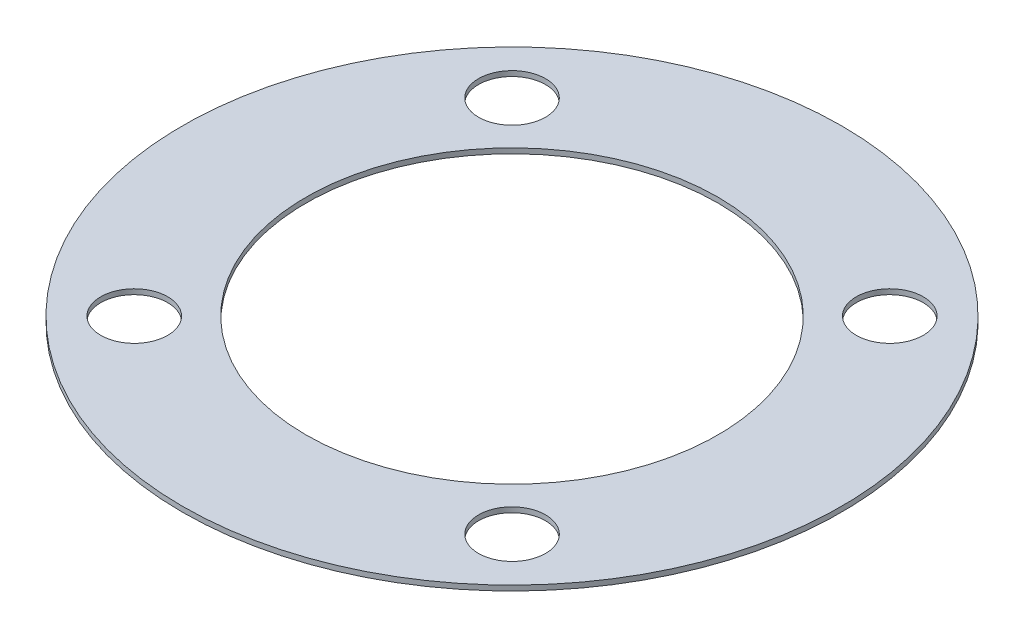
ISO-10303-21;
HEADER;
FILE_DESCRIPTION(('STEP AP214'),'2;1');
FILE_NAME('part.step','',(''),(''),'','','');
FILE_SCHEMA(('AUTOMOTIVE_DESIGN { 1 0 10303 214 1 1 1 1 }'));
ENDSEC;
DATA;
#1=APPLICATION_CONTEXT('core data for automotive mechanical design processes');
#2=APPLICATION_PROTOCOL_DEFINITION('international standard','automotive_design',2000,#1);
#3=PRODUCT_CONTEXT('',#1,'mechanical');
#4=PRODUCT('Part','Part','',(#3));
#5=PRODUCT_RELATED_PRODUCT_CATEGORY('part','',(#4));
#6=PRODUCT_DEFINITION_FORMATION('','',#4);
#7=PRODUCT_DEFINITION_CONTEXT('part definition',#1,'design');
#8=PRODUCT_DEFINITION('design','',#6,#7);
#9=PRODUCT_DEFINITION_SHAPE('','',#8);
#10=(LENGTH_UNIT() NAMED_UNIT(*) SI_UNIT(.MILLI.,.METRE.));
#11=(NAMED_UNIT(*) PLANE_ANGLE_UNIT() SI_UNIT($,.RADIAN.));
#12=(NAMED_UNIT(*) SI_UNIT($,.STERADIAN.) SOLID_ANGLE_UNIT());
#13=UNCERTAINTY_MEASURE_WITH_UNIT(LENGTH_MEASURE(1.E-05),#10,'distance_accuracy_value','');
#14=(GEOMETRIC_REPRESENTATION_CONTEXT(3) GLOBAL_UNCERTAINTY_ASSIGNED_CONTEXT((#13)) GLOBAL_UNIT_ASSIGNED_CONTEXT((#10,
#11,#12)) REPRESENTATION_CONTEXT('',''));
#15=CARTESIAN_POINT('',(0.,0.,0.));
#16=DIRECTION('',(0.,0.,1.));
#17=DIRECTION('',(1.,0.,0.));
#18=AXIS2_PLACEMENT_3D('',#15,#16,#17);
#19=CARTESIAN_POINT('',(0.,0.5,0.));
#20=DIRECTION('',(0.,-1.,0.));
#21=DIRECTION('',(0.,0.,-1.));
#22=AXIS2_PLACEMENT_3D('',#19,#20,#21);
#23=CYLINDRICAL_SURFACE('',#22,32.);
#24=CARTESIAN_POINT('',(0.,0.5,0.));
#25=DIRECTION('',(0.,1.,0.));
#26=DIRECTION('',(0.,0.,1.));
#27=AXIS2_PLACEMENT_3D('',#24,#25,#26);
#28=CIRCLE('',#27,32.);
#29=CARTESIAN_POINT('',(0.,0.5,32.));
#30=VERTEX_POINT('',#29);
#31=EDGE_CURVE('E10',#30,#30,#28,.T.);
#32=ORIENTED_EDGE('',*,*,#31,.F.);
#33=EDGE_LOOP('',(#32));
#34=FACE_BOUND('',#33,.T.);
#35=CARTESIAN_POINT('',(0.,0.,0.));
#36=DIRECTION('',(0.,1.,0.));
#37=DIRECTION('',(0.,0.,1.));
#38=AXIS2_PLACEMENT_3D('',#35,#36,#37);
#39=CIRCLE('',#38,32.);
#40=CARTESIAN_POINT('',(0.,0.,32.));
#41=VERTEX_POINT('',#40);
#42=EDGE_CURVE('E39',#41,#41,#39,.T.);
#43=ORIENTED_EDGE('',*,*,#42,.T.);
#44=EDGE_LOOP('',(#43));
#45=FACE_BOUND('',#44,.T.);
#46=ADVANCED_FACE('F36',(#34,#45),#23,.T.);
#47=CARTESIAN_POINT('',(0.,0.5,0.));
#48=DIRECTION('',(0.,1.,0.));
#49=DIRECTION('',(0.,0.,1.));
#50=AXIS2_PLACEMENT_3D('',#47,#48,#49);
#51=PLANE('',#50);
#52=CARTESIAN_POINT('',(18.3424515582806,0.5,18.3393317385137));
#53=DIRECTION('',(0.,1.,0.));
#54=DIRECTION('',(0.,0.,1.));
#55=AXIS2_PLACEMENT_3D('',#52,#53,#54);
#56=CIRCLE('',#55,3.25);
#57=CARTESIAN_POINT('',(18.3424515582806,0.5,21.5893317385137));
#58=VERTEX_POINT('',#57);
#59=EDGE_CURVE('E66',#58,#58,#56,.T.);
#60=ORIENTED_EDGE('',*,*,#59,.F.);
#61=EDGE_LOOP('',(#60));
#62=FACE_BOUND('',#61,.T.);
#63=CARTESIAN_POINT('',(-18.3393317385137,0.5,18.3424515582806));
#64=DIRECTION('',(0.,1.,0.));
#65=DIRECTION('',(0.,0.,1.));
#66=AXIS2_PLACEMENT_3D('',#63,#64,#65);
#67=CIRCLE('',#66,3.25);
#68=CARTESIAN_POINT('',(-18.3393317385137,0.5,21.5924515582806));
#69=VERTEX_POINT('',#68);
#70=EDGE_CURVE('E74',#69,#69,#67,.T.);
#71=ORIENTED_EDGE('',*,*,#70,.F.);
#72=EDGE_LOOP('',(#71));
#73=FACE_BOUND('',#72,.T.);
#74=CARTESIAN_POINT('',(-18.3393317385137,0.5,-18.3424515582806));
#75=DIRECTION('',(0.,1.,0.));
#76=DIRECTION('',(0.,0.,1.));
#77=AXIS2_PLACEMENT_3D('',#74,#75,#76);
#78=CIRCLE('',#77,3.25);
#79=CARTESIAN_POINT('',(-18.3393317385137,0.5,-15.0924515582806));
#80=VERTEX_POINT('',#79);
#81=EDGE_CURVE('E82',#80,#80,#78,.T.);
#82=ORIENTED_EDGE('',*,*,#81,.F.);
#83=EDGE_LOOP('',(#82));
#84=FACE_BOUND('',#83,.T.);
#85=CARTESIAN_POINT('',(18.3424515582806,0.5,-18.3393317385137));
#86=DIRECTION('',(0.,1.,0.));
#87=DIRECTION('',(0.,0.,1.));
#88=AXIS2_PLACEMENT_3D('',#85,#86,#87);
#89=CIRCLE('',#88,3.25);
#90=CARTESIAN_POINT('',(18.3424515582806,0.5,-15.0893317385137));
#91=VERTEX_POINT('',#90);
#92=EDGE_CURVE('E58',#91,#91,#89,.T.);
#93=ORIENTED_EDGE('',*,*,#92,.F.);
#94=EDGE_LOOP('',(#93));
#95=FACE_BOUND('',#94,.T.);
#96=CARTESIAN_POINT('',(0.,0.5,0.));
#97=DIRECTION('',(0.,1.,0.));
#98=DIRECTION('',(0.,0.,1.));
#99=AXIS2_PLACEMENT_3D('',#96,#97,#98);
#100=CIRCLE('',#99,20.);
#101=CARTESIAN_POINT('',(0.,0.5,20.));
#102=VERTEX_POINT('',#101);
#103=EDGE_CURVE('E50',#102,#102,#100,.T.);
#104=ORIENTED_EDGE('',*,*,#103,.F.);
#105=EDGE_LOOP('',(#104));
#106=FACE_BOUND('',#105,.T.);
#107=ORIENTED_EDGE('',*,*,#31,.T.);
#108=EDGE_LOOP('',(#107));
#109=FACE_BOUND('',#108,.T.);
#110=ADVANCED_FACE('F101',(#62,#73,#84,#95,#106,#109),#51,.T.);
#111=CARTESIAN_POINT('',(0.,0.,0.));
#112=DIRECTION('',(0.,1.,0.));
#113=DIRECTION('',(0.,0.,1.));
#114=AXIS2_PLACEMENT_3D('',#111,#112,#113);
#115=PLANE('',#114);
#116=CARTESIAN_POINT('',(18.3424515582806,0.,18.3393317385137));
#117=DIRECTION('',(0.,1.,0.));
#118=DIRECTION('',(0.,0.,1.));
#119=AXIS2_PLACEMENT_3D('',#116,#117,#118);
#120=CIRCLE('',#119,3.25);
#121=CARTESIAN_POINT('',(18.3424515582806,0.,21.5893317385137));
#122=VERTEX_POINT('',#121);
#123=EDGE_CURVE('E70',#122,#122,#120,.T.);
#124=ORIENTED_EDGE('',*,*,#123,.T.);
#125=EDGE_LOOP('',(#124));
#126=FACE_BOUND('',#125,.T.);
#127=CARTESIAN_POINT('',(-18.3393317385137,0.,18.3424515582806));
#128=DIRECTION('',(0.,1.,0.));
#129=DIRECTION('',(0.,0.,1.));
#130=AXIS2_PLACEMENT_3D('',#127,#128,#129);
#131=CIRCLE('',#130,3.25);
#132=CARTESIAN_POINT('',(-18.3393317385137,0.,21.5924515582806));
#133=VERTEX_POINT('',#132);
#134=EDGE_CURVE('E78',#133,#133,#131,.T.);
#135=ORIENTED_EDGE('',*,*,#134,.T.);
#136=EDGE_LOOP('',(#135));
#137=FACE_BOUND('',#136,.T.);
#138=CARTESIAN_POINT('',(-18.3393317385137,0.,-18.3424515582806));
#139=DIRECTION('',(0.,1.,0.));
#140=DIRECTION('',(0.,0.,1.));
#141=AXIS2_PLACEMENT_3D('',#138,#139,#140);
#142=CIRCLE('',#141,3.25);
#143=CARTESIAN_POINT('',(-18.3393317385137,0.,-15.0924515582806));
#144=VERTEX_POINT('',#143);
#145=EDGE_CURVE('E62',#144,#144,#142,.T.);
#146=ORIENTED_EDGE('',*,*,#145,.T.);
#147=EDGE_LOOP('',(#146));
#148=FACE_BOUND('',#147,.T.);
#149=CARTESIAN_POINT('',(18.3424515582806,0.,-18.3393317385137));
#150=DIRECTION('',(0.,1.,0.));
#151=DIRECTION('',(0.,0.,1.));
#152=AXIS2_PLACEMENT_3D('',#149,#150,#151);
#153=CIRCLE('',#152,3.25);
#154=CARTESIAN_POINT('',(18.3424515582806,0.,-15.0893317385137));
#155=VERTEX_POINT('',#154);
#156=EDGE_CURVE('E54',#155,#155,#153,.T.);
#157=ORIENTED_EDGE('',*,*,#156,.T.);
#158=EDGE_LOOP('',(#157));
#159=FACE_BOUND('',#158,.T.);
#160=CARTESIAN_POINT('',(0.,0.,0.));
#161=DIRECTION('',(0.,1.,0.));
#162=DIRECTION('',(0.,0.,1.));
#163=AXIS2_PLACEMENT_3D('',#160,#161,#162);
#164=CIRCLE('',#163,20.);
#165=CARTESIAN_POINT('',(0.,0.,20.));
#166=VERTEX_POINT('',#165);
#167=EDGE_CURVE('E48',#166,#166,#164,.T.);
#168=ORIENTED_EDGE('',*,*,#167,.T.);
#169=EDGE_LOOP('',(#168));
#170=FACE_BOUND('',#169,.T.);
#171=ORIENTED_EDGE('',*,*,#42,.F.);
#172=EDGE_LOOP('',(#171));
#173=FACE_BOUND('',#172,.T.);
#174=ADVANCED_FACE('F90',(#126,#137,#148,#159,#170,#173),#115,.F.);
#175=CARTESIAN_POINT('',(0.,0.,0.));
#176=DIRECTION('',(0.,1.,0.));
#177=DIRECTION('',(0.,0.,1.));
#178=AXIS2_PLACEMENT_3D('',#175,#176,#177);
#179=CYLINDRICAL_SURFACE('',#178,20.);
#180=ORIENTED_EDGE('',*,*,#167,.F.);
#181=EDGE_LOOP('',(#180));
#182=FACE_BOUND('',#181,.T.);
#183=ORIENTED_EDGE('',*,*,#103,.T.);
#184=EDGE_LOOP('',(#183));
#185=FACE_BOUND('',#184,.T.);
#186=ADVANCED_FACE('F110',(#182,#185),#179,.F.);
#187=CARTESIAN_POINT('',(18.3424515582806,0.,-18.3393317385137));
#188=DIRECTION('',(0.,1.,0.));
#189=DIRECTION('',(0.,0.,1.));
#190=AXIS2_PLACEMENT_3D('',#187,#188,#189);
#191=CYLINDRICAL_SURFACE('',#190,3.25);
#192=ORIENTED_EDGE('',*,*,#156,.F.);
#193=EDGE_LOOP('',(#192));
#194=FACE_BOUND('',#193,.T.);
#195=ORIENTED_EDGE('',*,*,#92,.T.);
#196=EDGE_LOOP('',(#195));
#197=FACE_BOUND('',#196,.T.);
#198=ADVANCED_FACE('F97',(#194,#197),#191,.F.);
#199=CARTESIAN_POINT('',(-18.3393317385137,0.,-18.3424515582806));
#200=DIRECTION('',(0.,1.,0.));
#201=DIRECTION('',(0.,0.,1.));
#202=AXIS2_PLACEMENT_3D('',#199,#200,#201);
#203=CYLINDRICAL_SURFACE('',#202,3.25);
#204=ORIENTED_EDGE('',*,*,#145,.F.);
#205=EDGE_LOOP('',(#204));
#206=FACE_BOUND('',#205,.T.);
#207=ORIENTED_EDGE('',*,*,#81,.T.);
#208=EDGE_LOOP('',(#207));
#209=FACE_BOUND('',#208,.T.);
#210=ADVANCED_FACE('F93',(#206,#209),#203,.F.);
#211=CARTESIAN_POINT('',(-18.3393317385137,0.,18.3424515582806));
#212=DIRECTION('',(0.,1.,0.));
#213=DIRECTION('',(0.,0.,1.));
#214=AXIS2_PLACEMENT_3D('',#211,#212,#213);
#215=CYLINDRICAL_SURFACE('',#214,3.25);
#216=ORIENTED_EDGE('',*,*,#134,.F.);
#217=EDGE_LOOP('',(#216));
#218=FACE_BOUND('',#217,.T.);
#219=ORIENTED_EDGE('',*,*,#70,.T.);
#220=EDGE_LOOP('',(#219));
#221=FACE_BOUND('',#220,.T.);
#222=ADVANCED_FACE('F96',(#218,#221),#215,.F.);
#223=CARTESIAN_POINT('',(18.3424515582806,0.,18.3393317385137));
#224=DIRECTION('',(0.,1.,0.));
#225=DIRECTION('',(0.,0.,1.));
#226=AXIS2_PLACEMENT_3D('',#223,#224,#225);
#227=CYLINDRICAL_SURFACE('',#226,3.25);
#228=ORIENTED_EDGE('',*,*,#123,.F.);
#229=EDGE_LOOP('',(#228));
#230=FACE_BOUND('',#229,.T.);
#231=ORIENTED_EDGE('',*,*,#59,.T.);
#232=EDGE_LOOP('',(#231));
#233=FACE_BOUND('',#232,.T.);
#234=ADVANCED_FACE('F161',(#230,#233),#227,.F.);
#235=CLOSED_SHELL('',(#46,#110,#174,#186,#198,#210,#222,#234));
#236=MANIFOLD_SOLID_BREP('B2',#235);
#237=ADVANCED_BREP_SHAPE_REPRESENTATION('',(#18,#236),#14);
#238=SHAPE_DEFINITION_REPRESENTATION(#9,#237);
ENDSEC;
END-ISO-10303-21;
